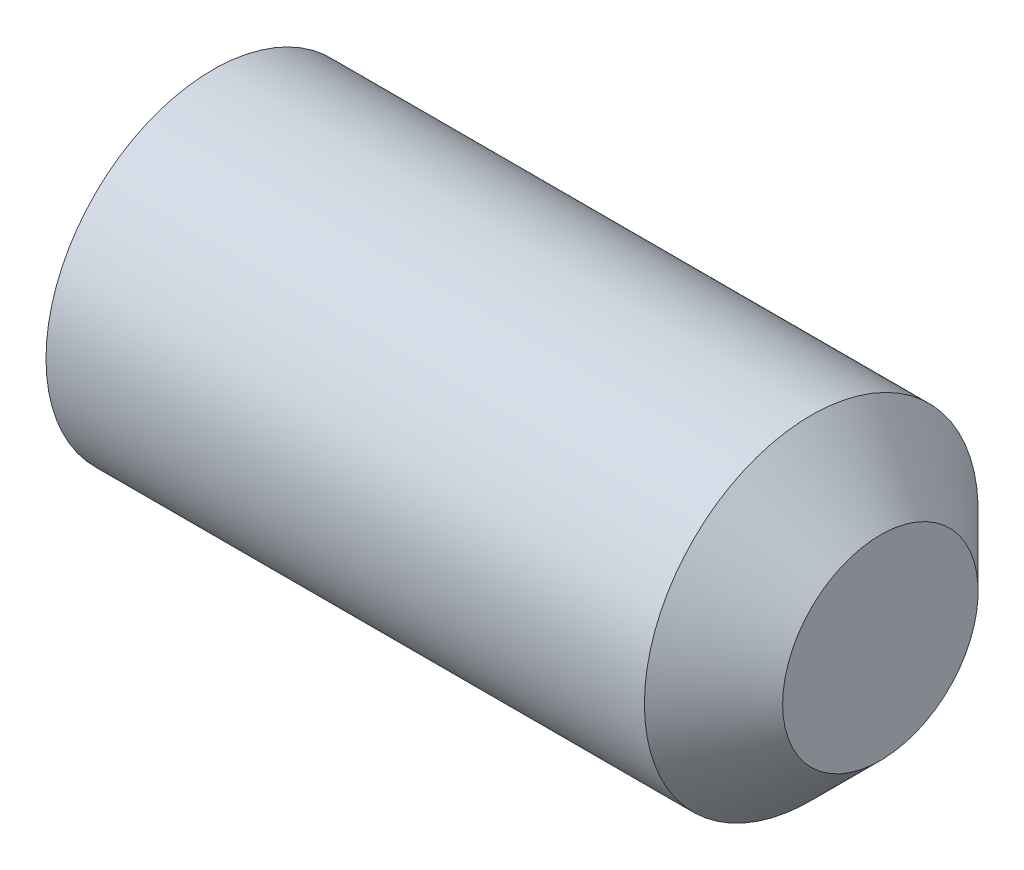
ISO-10303-21;
HEADER;
FILE_DESCRIPTION(('STEP AP214'),'2;1');
FILE_NAME('part.step','',(''),(''),'','','');
FILE_SCHEMA(('AUTOMOTIVE_DESIGN { 1 0 10303 214 1 1 1 1 }'));
ENDSEC;
DATA;
#1=APPLICATION_CONTEXT('core data for automotive mechanical design processes');
#2=APPLICATION_PROTOCOL_DEFINITION('international standard','automotive_design',2000,#1);
#3=PRODUCT_CONTEXT('',#1,'mechanical');
#4=PRODUCT('Part','Part','',(#3));
#5=PRODUCT_RELATED_PRODUCT_CATEGORY('part','',(#4));
#6=PRODUCT_DEFINITION_FORMATION('','',#4);
#7=PRODUCT_DEFINITION_CONTEXT('part definition',#1,'design');
#8=PRODUCT_DEFINITION('design','',#6,#7);
#9=PRODUCT_DEFINITION_SHAPE('','',#8);
#10=(LENGTH_UNIT() NAMED_UNIT(*) SI_UNIT(.MILLI.,.METRE.));
#11=(NAMED_UNIT(*) PLANE_ANGLE_UNIT() SI_UNIT($,.RADIAN.));
#12=(NAMED_UNIT(*) SI_UNIT($,.STERADIAN.) SOLID_ANGLE_UNIT());
#13=UNCERTAINTY_MEASURE_WITH_UNIT(LENGTH_MEASURE(1.E-05),#10,'distance_accuracy_value','');
#14=(GEOMETRIC_REPRESENTATION_CONTEXT(3) GLOBAL_UNCERTAINTY_ASSIGNED_CONTEXT((#13)) GLOBAL_UNIT_ASSIGNED_CONTEXT((#10,
#11,#12)) REPRESENTATION_CONTEXT('',''));
#15=CARTESIAN_POINT('',(0.,0.,0.));
#16=DIRECTION('',(0.,0.,1.));
#17=DIRECTION('',(1.,0.,0.));
#18=AXIS2_PLACEMENT_3D('',#15,#16,#17);
#19=CARTESIAN_POINT('',(0.,2.5,0.));
#20=DIRECTION('',(1.,0.,0.));
#21=DIRECTION('',(0.,0.,-1.));
#22=AXIS2_PLACEMENT_3D('',#19,#20,#21);
#23=PLANE('',#22);
#24=DIRECTION('',(0.,-0.866025403784439,-0.5));
#25=VECTOR('',#24,1.);
#26=CARTESIAN_POINT('',(0.,1.25,-0.721687836487032));
#27=LINE('',#26,#25);
#28=CARTESIAN_POINT('',(0.,1.25,-0.721687836487032));
#29=VERTEX_POINT('',#28);
#30=CARTESIAN_POINT('',(0.,0.,-1.44337567297406));
#31=VERTEX_POINT('',#30);
#32=EDGE_CURVE('E122',#29,#31,#27,.T.);
#33=ORIENTED_EDGE('',*,*,#32,.F.);
#34=DIRECTION('',(0.,0.,-1.));
#35=VECTOR('',#34,1.);
#36=CARTESIAN_POINT('',(0.,1.25,0.721687836487033));
#37=LINE('',#36,#35);
#38=CARTESIAN_POINT('',(0.,1.25,0.721687836487033));
#39=VERTEX_POINT('',#38);
#40=EDGE_CURVE('E48',#39,#29,#37,.T.);
#41=ORIENTED_EDGE('',*,*,#40,.F.);
#42=DIRECTION('',(0.,0.866025403784439,-0.5));
#43=VECTOR('',#42,1.);
#44=CARTESIAN_POINT('',(0.,0.,1.44337567297406));
#45=LINE('',#44,#43);
#46=CARTESIAN_POINT('',(0.,0.,1.44337567297406));
#47=VERTEX_POINT('',#46);
#48=EDGE_CURVE('E131',#47,#39,#45,.T.);
#49=ORIENTED_EDGE('',*,*,#48,.F.);
#50=DIRECTION('',(0.,0.866025403784439,0.5));
#51=VECTOR('',#50,1.);
#52=CARTESIAN_POINT('',(0.,-1.25,0.721687836487032));
#53=LINE('',#52,#51);
#54=CARTESIAN_POINT('',(0.,-1.25,0.721687836487032));
#55=VERTEX_POINT('',#54);
#56=EDGE_CURVE('E129',#55,#47,#53,.T.);
#57=ORIENTED_EDGE('',*,*,#56,.F.);
#58=DIRECTION('',(0.,0.,1.));
#59=VECTOR('',#58,1.);
#60=CARTESIAN_POINT('',(0.,-1.25,-0.721687836487033));
#61=LINE('',#60,#59);
#62=CARTESIAN_POINT('',(0.,-1.25,-0.721687836487033));
#63=VERTEX_POINT('',#62);
#64=EDGE_CURVE('E96',#63,#55,#61,.T.);
#65=ORIENTED_EDGE('',*,*,#64,.F.);
#66=DIRECTION('',(0.,-0.866025403784439,0.5));
#67=VECTOR('',#66,1.);
#68=CARTESIAN_POINT('',(0.,0.,-1.44337567297406));
#69=LINE('',#68,#67);
#70=EDGE_CURVE('E125',#31,#63,#69,.T.);
#71=ORIENTED_EDGE('',*,*,#70,.F.);
#72=EDGE_LOOP('',(#33,#41,#49,#57,#65,#71));
#73=FACE_BOUND('',#72,.T.);
#74=CARTESIAN_POINT('',(0.,0.,0.));
#75=DIRECTION('',(-1.,0.,0.));
#76=DIRECTION('',(0.,0.,1.));
#77=AXIS2_PLACEMENT_3D('',#74,#75,#76);
#78=CIRCLE('',#77,2.5);
#79=CARTESIAN_POINT('',(0.,0.,2.5));
#80=VERTEX_POINT('',#79);
#81=EDGE_CURVE('E11',#80,#80,#78,.T.);
#82=ORIENTED_EDGE('',*,*,#81,.T.);
#83=EDGE_LOOP('',(#82));
#84=FACE_BOUND('',#83,.T.);
#85=ADVANCED_FACE('F34',(#73,#84),#23,.F.);
#86=CARTESIAN_POINT('',(0.,0.,0.));
#87=DIRECTION('',(-1.,0.,0.));
#88=DIRECTION('',(0.,0.,1.));
#89=AXIS2_PLACEMENT_3D('',#86,#87,#88);
#90=CYLINDRICAL_SURFACE('',#89,2.5);
#91=ORIENTED_EDGE('',*,*,#81,.F.);
#92=EDGE_LOOP('',(#91));
#93=FACE_BOUND('',#92,.T.);
#94=CARTESIAN_POINT('',(8.96446609406727,0.,0.));
#95=DIRECTION('',(-1.,0.,0.));
#96=DIRECTION('',(0.,0.,1.));
#97=AXIS2_PLACEMENT_3D('',#94,#95,#96);
#98=CIRCLE('',#97,2.5);
#99=CARTESIAN_POINT('',(8.96446609406727,0.,2.5));
#100=VERTEX_POINT('',#99);
#101=EDGE_CURVE('E41',#100,#100,#98,.T.);
#102=ORIENTED_EDGE('',*,*,#101,.T.);
#103=EDGE_LOOP('',(#102));
#104=FACE_BOUND('',#103,.T.);
#105=ADVANCED_FACE('F145',(#93,#104),#90,.T.);
#106=CARTESIAN_POINT('',(10.,0.,0.));
#107=DIRECTION('',(-1.,0.,0.));
#108=DIRECTION('',(0.,0.,1.));
#109=AXIS2_PLACEMENT_3D('',#106,#107,#108);
#110=CONICAL_SURFACE('',#109,1.46446609406726,0.78539816339745);
#111=ORIENTED_EDGE('',*,*,#101,.F.);
#112=EDGE_LOOP('',(#111));
#113=FACE_BOUND('',#112,.T.);
#114=CARTESIAN_POINT('',(10.,0.,0.));
#115=DIRECTION('',(-1.,0.,0.));
#116=DIRECTION('',(0.,0.,1.));
#117=AXIS2_PLACEMENT_3D('',#114,#115,#116);
#118=CIRCLE('',#117,1.46446609406726);
#119=CARTESIAN_POINT('',(10.,0.,1.46446609406726));
#120=VERTEX_POINT('',#119);
#121=EDGE_CURVE('E135',#120,#120,#118,.T.);
#122=ORIENTED_EDGE('',*,*,#121,.T.);
#123=EDGE_LOOP('',(#122));
#124=FACE_BOUND('',#123,.T.);
#125=ADVANCED_FACE('F147',(#113,#124),#110,.T.);
#126=CARTESIAN_POINT('',(10.,1.46446609406726,0.));
#127=DIRECTION('',(-1.,0.,0.));
#128=DIRECTION('',(0.,0.,1.));
#129=AXIS2_PLACEMENT_3D('',#126,#127,#128);
#130=PLANE('',#129);
#131=ORIENTED_EDGE('',*,*,#121,.F.);
#132=EDGE_LOOP('',(#131));
#133=FACE_BOUND('',#132,.T.);
#134=ADVANCED_FACE('F150',(#133),#130,.F.);
#135=CARTESIAN_POINT('',(2.,1.25,0.721687836487033));
#136=DIRECTION('',(0.,1.,0.));
#137=DIRECTION('',(0.,0.,1.));
#138=AXIS2_PLACEMENT_3D('',#135,#136,#137);
#139=PLANE('',#138);
#140=ORIENTED_EDGE('',*,*,#40,.T.);
#141=DIRECTION('',(-1.,0.,0.));
#142=VECTOR('',#141,1.);
#143=CARTESIAN_POINT('',(2.,1.25,-0.721687836487032));
#144=LINE('',#143,#142);
#145=CARTESIAN_POINT('',(2.,1.25,-0.721687836487032));
#146=VERTEX_POINT('',#145);
#147=EDGE_CURVE('E78',#146,#29,#144,.T.);
#148=ORIENTED_EDGE('',*,*,#147,.F.);
#149=DIRECTION('',(0.,0.,-1.));
#150=VECTOR('',#149,1.);
#151=CARTESIAN_POINT('',(2.,1.25,0.721687836487033));
#152=LINE('',#151,#150);
#153=CARTESIAN_POINT('',(2.,1.25,0.721687836487033));
#154=VERTEX_POINT('',#153);
#155=EDGE_CURVE('E133',#154,#146,#152,.T.);
#156=ORIENTED_EDGE('',*,*,#155,.F.);
#157=DIRECTION('',(-1.,0.,0.));
#158=VECTOR('',#157,1.);
#159=CARTESIAN_POINT('',(2.,1.25,0.721687836487033));
#160=LINE('',#159,#158);
#161=EDGE_CURVE('E56',#154,#39,#160,.T.);
#162=ORIENTED_EDGE('',*,*,#161,.T.);
#163=EDGE_LOOP('',(#140,#148,#156,#162));
#164=FACE_BOUND('',#163,.T.);
#165=ADVANCED_FACE('F155',(#164),#139,.F.);
#166=CARTESIAN_POINT('',(2.,0.,1.44337567297406));
#167=DIRECTION('',(0.,0.5,0.866025403784439));
#168=DIRECTION('',(0.,-0.866025403784439,0.5));
#169=AXIS2_PLACEMENT_3D('',#166,#167,#168);
#170=PLANE('',#169);
#171=ORIENTED_EDGE('',*,*,#48,.T.);
#172=ORIENTED_EDGE('',*,*,#161,.F.);
#173=DIRECTION('',(0.,0.866025403784439,-0.5));
#174=VECTOR('',#173,1.);
#175=CARTESIAN_POINT('',(2.,0.,1.44337567297406));
#176=LINE('',#175,#174);
#177=CARTESIAN_POINT('',(2.,0.,1.44337567297406));
#178=VERTEX_POINT('',#177);
#179=EDGE_CURVE('E108',#178,#154,#176,.T.);
#180=ORIENTED_EDGE('',*,*,#179,.F.);
#181=DIRECTION('',(-1.,0.,0.));
#182=VECTOR('',#181,1.);
#183=CARTESIAN_POINT('',(2.,0.,1.44337567297406));
#184=LINE('',#183,#182);
#185=EDGE_CURVE('E100',#178,#47,#184,.T.);
#186=ORIENTED_EDGE('',*,*,#185,.T.);
#187=EDGE_LOOP('',(#171,#172,#180,#186));
#188=FACE_BOUND('',#187,.T.);
#189=ADVANCED_FACE('F160',(#188),#170,.F.);
#190=CARTESIAN_POINT('',(2.,-1.25,0.721687836487032));
#191=DIRECTION('',(0.,-0.5,0.866025403784439));
#192=DIRECTION('',(0.,-0.866025403784439,-0.5));
#193=AXIS2_PLACEMENT_3D('',#190,#191,#192);
#194=PLANE('',#193);
#195=ORIENTED_EDGE('',*,*,#56,.T.);
#196=ORIENTED_EDGE('',*,*,#185,.F.);
#197=DIRECTION('',(0.,0.866025403784439,0.5));
#198=VECTOR('',#197,1.);
#199=CARTESIAN_POINT('',(2.,-1.25,0.721687836487032));
#200=LINE('',#199,#198);
#201=CARTESIAN_POINT('',(2.,-1.25,0.721687836487032));
#202=VERTEX_POINT('',#201);
#203=EDGE_CURVE('E104',#202,#178,#200,.T.);
#204=ORIENTED_EDGE('',*,*,#203,.F.);
#205=DIRECTION('',(-1.,0.,0.));
#206=VECTOR('',#205,1.);
#207=CARTESIAN_POINT('',(2.,-1.25,0.721687836487032));
#208=LINE('',#207,#206);
#209=EDGE_CURVE('E89',#202,#55,#208,.T.);
#210=ORIENTED_EDGE('',*,*,#209,.T.);
#211=EDGE_LOOP('',(#195,#196,#204,#210));
#212=FACE_BOUND('',#211,.T.);
#213=ADVANCED_FACE('F105',(#212),#194,.F.);
#214=CARTESIAN_POINT('',(2.,-1.25,-0.721687836487033));
#215=DIRECTION('',(0.,-1.,0.));
#216=DIRECTION('',(0.,0.,-1.));
#217=AXIS2_PLACEMENT_3D('',#214,#215,#216);
#218=PLANE('',#217);
#219=ORIENTED_EDGE('',*,*,#64,.T.);
#220=ORIENTED_EDGE('',*,*,#209,.F.);
#221=DIRECTION('',(0.,0.,1.));
#222=VECTOR('',#221,1.);
#223=CARTESIAN_POINT('',(2.,-1.25,-0.721687836487033));
#224=LINE('',#223,#222);
#225=CARTESIAN_POINT('',(2.,-1.25,-0.721687836487033));
#226=VERTEX_POINT('',#225);
#227=EDGE_CURVE('E93',#226,#202,#224,.T.);
#228=ORIENTED_EDGE('',*,*,#227,.F.);
#229=DIRECTION('',(-1.,0.,0.));
#230=VECTOR('',#229,1.);
#231=CARTESIAN_POINT('',(2.,-1.25,-0.721687836487033));
#232=LINE('',#231,#230);
#233=EDGE_CURVE('E101',#226,#63,#232,.T.);
#234=ORIENTED_EDGE('',*,*,#233,.T.);
#235=EDGE_LOOP('',(#219,#220,#228,#234));
#236=FACE_BOUND('',#235,.T.);
#237=ADVANCED_FACE('F91',(#236),#218,.F.);
#238=CARTESIAN_POINT('',(2.,0.,-1.44337567297406));
#239=DIRECTION('',(0.,-0.5,-0.866025403784439));
#240=DIRECTION('',(0.,0.866025403784439,-0.5));
#241=AXIS2_PLACEMENT_3D('',#238,#239,#240);
#242=PLANE('',#241);
#243=ORIENTED_EDGE('',*,*,#70,.T.);
#244=ORIENTED_EDGE('',*,*,#233,.F.);
#245=DIRECTION('',(0.,-0.866025403784439,0.5));
#246=VECTOR('',#245,1.);
#247=CARTESIAN_POINT('',(2.,0.,-1.44337567297406));
#248=LINE('',#247,#246);
#249=CARTESIAN_POINT('',(2.,0.,-1.44337567297406));
#250=VERTEX_POINT('',#249);
#251=EDGE_CURVE('E114',#250,#226,#248,.T.);
#252=ORIENTED_EDGE('',*,*,#251,.F.);
#253=DIRECTION('',(-1.,0.,0.));
#254=VECTOR('',#253,1.);
#255=CARTESIAN_POINT('',(2.,0.,-1.44337567297406));
#256=LINE('',#255,#254);
#257=EDGE_CURVE('E138',#250,#31,#256,.T.);
#258=ORIENTED_EDGE('',*,*,#257,.T.);
#259=EDGE_LOOP('',(#243,#244,#252,#258));
#260=FACE_BOUND('',#259,.T.);
#261=ADVANCED_FACE('F186',(#260),#242,.F.);
#262=CARTESIAN_POINT('',(2.,1.25,-0.721687836487032));
#263=DIRECTION('',(0.,0.5,-0.866025403784439));
#264=DIRECTION('',(0.,0.866025403784439,0.5));
#265=AXIS2_PLACEMENT_3D('',#262,#263,#264);
#266=PLANE('',#265);
#267=ORIENTED_EDGE('',*,*,#32,.T.);
#268=ORIENTED_EDGE('',*,*,#257,.F.);
#269=DIRECTION('',(0.,-0.866025403784439,-0.5));
#270=VECTOR('',#269,1.);
#271=CARTESIAN_POINT('',(2.,1.25,-0.721687836487032));
#272=LINE('',#271,#270);
#273=EDGE_CURVE('E116',#146,#250,#272,.T.);
#274=ORIENTED_EDGE('',*,*,#273,.F.);
#275=ORIENTED_EDGE('',*,*,#147,.T.);
#276=EDGE_LOOP('',(#267,#268,#274,#275));
#277=FACE_BOUND('',#276,.T.);
#278=ADVANCED_FACE('F174',(#277),#266,.F.);
#279=CARTESIAN_POINT('',(2.,1.25,-2.1650635094611));
#280=DIRECTION('',(-1.,0.,0.));
#281=DIRECTION('',(0.,0.,1.));
#282=AXIS2_PLACEMENT_3D('',#279,#280,#281);
#283=PLANE('',#282);
#284=ORIENTED_EDGE('',*,*,#155,.T.);
#285=ORIENTED_EDGE('',*,*,#273,.T.);
#286=ORIENTED_EDGE('',*,*,#251,.T.);
#287=ORIENTED_EDGE('',*,*,#227,.T.);
#288=ORIENTED_EDGE('',*,*,#203,.T.);
#289=ORIENTED_EDGE('',*,*,#179,.T.);
#290=EDGE_LOOP('',(#284,#285,#286,#287,#288,#289));
#291=FACE_BOUND('',#290,.T.);
#292=ADVANCED_FACE('F111',(#291),#283,.T.);
#293=CLOSED_SHELL('',(#85,#105,#125,#134,#165,#189,#213,#237,#261,#278,#292));
#294=MANIFOLD_SOLID_BREP('B2',#293);
#295=ADVANCED_BREP_SHAPE_REPRESENTATION('',(#18,#294),#14);
#296=SHAPE_DEFINITION_REPRESENTATION(#9,#295);
ENDSEC;
END-ISO-10303-21;
